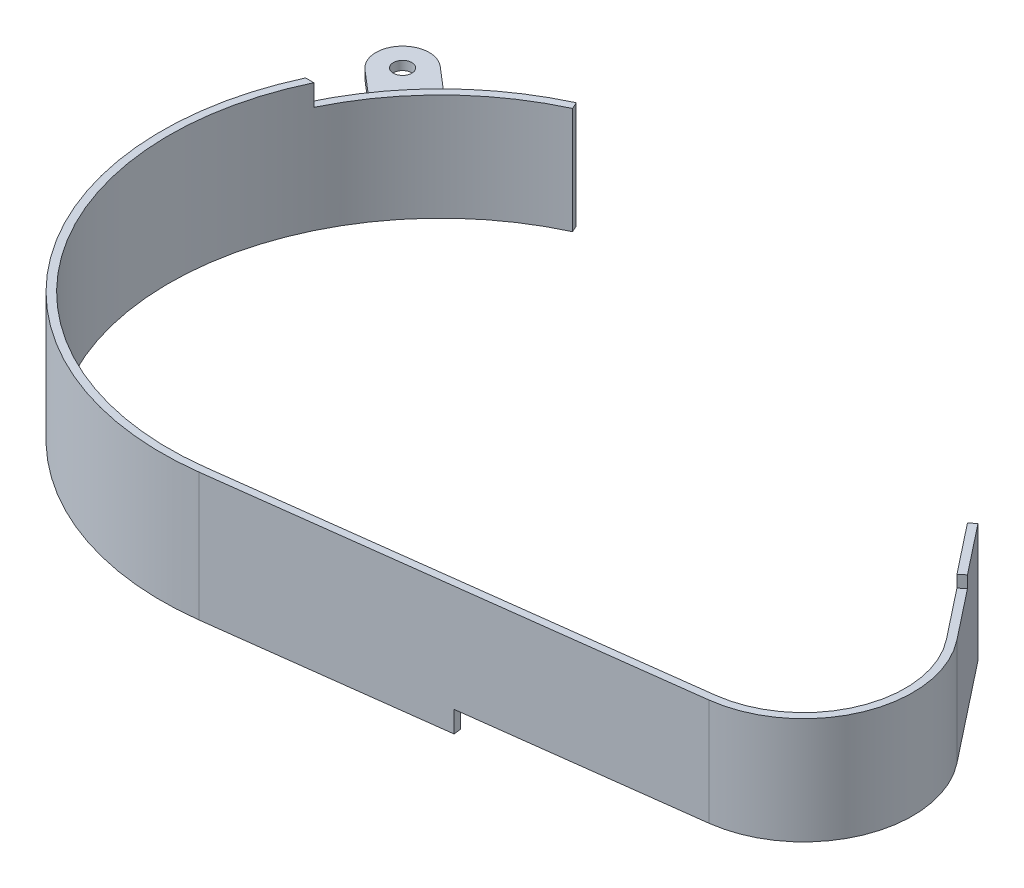
ISO-10303-21;
HEADER;
FILE_DESCRIPTION(('STEP AP214'),'2;1');
FILE_NAME('part.step','',(''),(''),'','','');
FILE_SCHEMA(('AUTOMOTIVE_DESIGN { 1 0 10303 214 1 1 1 1 }'));
ENDSEC;
DATA;
#1=APPLICATION_CONTEXT('core data for automotive mechanical design processes');
#2=APPLICATION_PROTOCOL_DEFINITION('international standard','automotive_design',2000,#1);
#3=PRODUCT_CONTEXT('',#1,'mechanical');
#4=PRODUCT('Part','Part','',(#3));
#5=PRODUCT_RELATED_PRODUCT_CATEGORY('part','',(#4));
#6=PRODUCT_DEFINITION_FORMATION('','',#4);
#7=PRODUCT_DEFINITION_CONTEXT('part definition',#1,'design');
#8=PRODUCT_DEFINITION('design','',#6,#7);
#9=PRODUCT_DEFINITION_SHAPE('','',#8);
#10=(LENGTH_UNIT() NAMED_UNIT(*) SI_UNIT(.MILLI.,.METRE.));
#11=(NAMED_UNIT(*) PLANE_ANGLE_UNIT() SI_UNIT($,.RADIAN.));
#12=(NAMED_UNIT(*) SI_UNIT($,.STERADIAN.) SOLID_ANGLE_UNIT());
#13=UNCERTAINTY_MEASURE_WITH_UNIT(LENGTH_MEASURE(1.E-05),#10,'distance_accuracy_value','');
#14=(GEOMETRIC_REPRESENTATION_CONTEXT(3) GLOBAL_UNCERTAINTY_ASSIGNED_CONTEXT((#13)) GLOBAL_UNIT_ASSIGNED_CONTEXT((#10,
#11,#12)) REPRESENTATION_CONTEXT('',''));
#15=CARTESIAN_POINT('',(0.,0.,0.));
#16=DIRECTION('',(0.,0.,1.));
#17=DIRECTION('',(1.,0.,0.));
#18=AXIS2_PLACEMENT_3D('',#15,#16,#17);
#19=CARTESIAN_POINT('',(-669.29,0.,84.2514773719377));
#20=DIRECTION('',(0.,-1.,0.));
#21=DIRECTION('',(0.,0.,-1.));
#22=AXIS2_PLACEMENT_3D('',#19,#20,#21);
#23=PLANE('',#22);
#24=DIRECTION('',(0.766194829754674,0.,-0.642608343283221));
#25=VECTOR('',#24,1.);
#26=CARTESIAN_POINT('',(-485.591791320348,0.,83.6321348892451));
#27=LINE('',#26,#25);
#28=CARTESIAN_POINT('',(-485.591791320348,0.,83.6321348892451));
#29=VERTEX_POINT('',#28);
#30=CARTESIAN_POINT('',(-483.547414247584,0.,81.9175138649877));
#31=VERTEX_POINT('',#30);
#32=EDGE_CURVE('E61',#29,#31,#27,.T.);
#33=ORIENTED_EDGE('',*,*,#32,.F.);
#34=DIRECTION('',(0.61913837589609,0.,0.785281905746435));
#35=VECTOR('',#34,1.);
#36=CARTESIAN_POINT('',(-471.62152618742,0.,101.351269826553));
#37=LINE('',#36,#35);
#38=CARTESIAN_POINT('',(-471.62152618742,0.,101.351269826552));
#39=VERTEX_POINT('',#38);
#40=EDGE_CURVE('E325',#29,#39,#37,.T.);
#41=ORIENTED_EDGE('',*,*,#40,.T.);
#42=CARTESIAN_POINT('',(-500.126000000001,0.,123.824999951937));
#43=DIRECTION('',(0.,-1.,0.));
#44=DIRECTION('',(0.,0.,1.));
#45=AXIS2_PLACEMENT_3D('',#42,#43,#44);
#46=CIRCLE('',#45,36.2983962880004);
#47=CARTESIAN_POINT('',(-495.540915966686,0.,159.832646049512));
#48=VERTEX_POINT('',#47);
#49=EDGE_CURVE('E327',#39,#48,#46,.T.);
#50=ORIENTED_EDGE('',*,*,#49,.T.);
#51=DIRECTION('',(-0.991989999003838,0.,0.126316435495806));
#52=VECTOR('',#51,1.);
#53=CARTESIAN_POINT('',(-657.047015902535,0.,180.398251423772));
#54=LINE('',#53,#52);
#55=CARTESIAN_POINT('',(-657.047015902535,0.,180.398251423772));
#56=VERTEX_POINT('',#55);
#57=EDGE_CURVE('E299',#48,#56,#54,.T.);
#58=ORIENTED_EDGE('',*,*,#57,.T.);
#59=CARTESIAN_POINT('',(-669.29,0.,84.2514773719377));
#60=DIRECTION('',(0.,-1.,0.));
#61=DIRECTION('',(0.,0.,-1.));
#62=AXIS2_PLACEMENT_3D('',#59,#60,#61);
#63=CIRCLE('',#62,96.9231284069251);
#64=CARTESIAN_POINT('',(-756.600744677042,0.,42.1690976373534));
#65=VERTEX_POINT('',#64);
#66=EDGE_CURVE('E294',#56,#65,#63,.T.);
#67=ORIENTED_EDGE('',*,*,#66,.T.);
#68=DIRECTION('',(1.,0.,0.));
#69=VECTOR('',#68,1.);
#70=CARTESIAN_POINT('',(-756.600744677042,0.,42.1690976373534));
#71=LINE('',#70,#69);
#72=CARTESIAN_POINT('',(-759.552212425699,0.,42.1690976373534));
#73=VERTEX_POINT('',#72);
#74=EDGE_CURVE('E272',#73,#65,#71,.T.);
#75=ORIENTED_EDGE('',*,*,#74,.F.);
#76=CARTESIAN_POINT('',(-669.29,0.,84.2514773719377));
#77=DIRECTION('',(0.,1.,0.));
#78=DIRECTION('',(0.,0.,-1.));
#79=AXIS2_PLACEMENT_3D('',#76,#77,#78);
#80=CIRCLE('',#79,99.590128406925);
#81=CARTESIAN_POINT('',(-656.710129969068,0.,183.043888751115));
#82=VERTEX_POINT('',#81);
#83=EDGE_CURVE('E315',#73,#82,#80,.T.);
#84=ORIENTED_EDGE('',*,*,#83,.T.);
#85=DIRECTION('',(0.991989999003838,0.,-0.126316435495805));
#86=VECTOR('',#85,1.);
#87=CARTESIAN_POINT('',(-656.710129969068,0.,183.043888751115));
#88=LINE('',#87,#86);
#89=CARTESIAN_POINT('',(-495.204030033218,0.,162.478283376855));
#90=VERTEX_POINT('',#89);
#91=EDGE_CURVE('E317',#82,#90,#88,.T.);
#92=ORIENTED_EDGE('',*,*,#91,.T.);
#93=CARTESIAN_POINT('',(-500.126,0.,123.824999951938));
#94=DIRECTION('',(0.,1.,0.));
#95=DIRECTION('',(0.,0.,-1.));
#96=AXIS2_PLACEMENT_3D('',#93,#94,#95);
#97=CIRCLE('',#96,38.9653962880001);
#98=CARTESIAN_POINT('',(-469.527179344794,0.,99.7000277780376));
#99=VERTEX_POINT('',#98);
#100=EDGE_CURVE('E320',#90,#99,#97,.T.);
#101=ORIENTED_EDGE('',*,*,#100,.T.);
#102=DIRECTION('',(-0.619138375896093,0.,-0.785281905746432));
#103=VECTOR('',#102,1.);
#104=CARTESIAN_POINT('',(-469.527179344794,0.,99.7000277780376));
#105=LINE('',#104,#103);
#106=EDGE_CURVE('E323',#99,#31,#105,.T.);
#107=ORIENTED_EDGE('',*,*,#106,.T.);
#108=EDGE_LOOP('',(#33,#41,#50,#58,#67,#75,#84,#92,#101,#107));
#109=FACE_BOUND('',#108,.T.);
#110=ADVANCED_FACE('F44',(#109),#23,.F.);
#111=CARTESIAN_POINT('',(-669.29,-38.1,84.2514773719377));
#112=DIRECTION('',(0.,1.,0.));
#113=DIRECTION('',(0.,0.,1.));
#114=AXIS2_PLACEMENT_3D('',#111,#112,#113);
#115=CYLINDRICAL_SURFACE('',#114,99.590128406925);
#116=DIRECTION('',(0.,1.,0.));
#117=VECTOR('',#116,1.);
#118=CARTESIAN_POINT('',(-759.552212425699,-7.62,42.1690976373533));
#119=LINE('',#118,#117);
#120=CARTESIAN_POINT('',(-759.552212425699,-7.62,42.1690976373533));
#121=VERTEX_POINT('',#120);
#122=EDGE_CURVE('E289',#121,#73,#119,.T.);
#123=ORIENTED_EDGE('',*,*,#122,.F.);
#124=CARTESIAN_POINT('',(-669.29,-7.62,84.2514773719377));
#125=DIRECTION('',(0.,1.,0.));
#126=DIRECTION('',(0.,0.,-1.));
#127=AXIS2_PLACEMENT_3D('',#124,#125,#126);
#128=CIRCLE('',#127,99.5901284069251);
#129=CARTESIAN_POINT('',(-711.2,-7.62,-6.0909023626467));
#130=VERTEX_POINT('',#129);
#131=EDGE_CURVE('E284',#130,#121,#128,.T.);
#132=ORIENTED_EDGE('',*,*,#131,.F.);
#133=DIRECTION('',(0.,1.,0.));
#134=VECTOR('',#133,1.);
#135=CARTESIAN_POINT('',(-711.2,-38.1,-6.0909023626466));
#136=LINE('',#135,#134);
#137=CARTESIAN_POINT('',(-711.2,-45.72,-6.0909023626466));
#138=VERTEX_POINT('',#137);
#139=EDGE_CURVE('E342',#138,#130,#136,.T.);
#140=ORIENTED_EDGE('',*,*,#139,.F.);
#141=CARTESIAN_POINT('',(-669.29,-45.72,84.2514773719377));
#142=DIRECTION('',(0.,-1.,0.));
#143=DIRECTION('',(0.,0.,-1.));
#144=AXIS2_PLACEMENT_3D('',#141,#142,#143);
#145=CIRCLE('',#144,99.590128406925);
#146=CARTESIAN_POINT('',(-656.710129969068,-45.72,183.043888751115));
#147=VERTEX_POINT('',#146);
#148=EDGE_CURVE('E229',#147,#138,#145,.T.);
#149=ORIENTED_EDGE('',*,*,#148,.F.);
#150=DIRECTION('',(0.,1.,0.));
#151=VECTOR('',#150,1.);
#152=CARTESIAN_POINT('',(-656.710129969068,-38.1,183.043888751115));
#153=LINE('',#152,#151);
#154=EDGE_CURVE('E340',#147,#82,#153,.T.);
#155=ORIENTED_EDGE('',*,*,#154,.T.);
#156=ORIENTED_EDGE('',*,*,#83,.F.);
#157=EDGE_LOOP('',(#123,#132,#140,#149,#155,#156));
#158=FACE_BOUND('',#157,.T.);
#159=DIRECTION('',(0.,1.,0.));
#160=VECTOR('',#159,1.);
#161=CARTESIAN_POINT('',(-751.193944792643,-15.10675668,27.5951670127952));
#162=LINE('',#161,#160);
#163=CARTESIAN_POINT('',(-751.193944792643,-15.10675668,27.5951670127951));
#164=VERTEX_POINT('',#163);
#165=CARTESIAN_POINT('',(-751.193944792643,-11.93175668,27.5951670127951));
#166=VERTEX_POINT('',#165);
#167=EDGE_CURVE('E257',#164,#166,#162,.T.);
#168=ORIENTED_EDGE('',*,*,#167,.F.);
#169=CARTESIAN_POINT('',(-669.29,-15.10675668,84.2514773719377));
#170=DIRECTION('',(0.,1.,0.));
#171=DIRECTION('',(0.,0.,1.));
#172=AXIS2_PLACEMENT_3D('',#169,#170,#171);
#173=CIRCLE('',#172,99.590128406925);
#174=CARTESIAN_POINT('',(-738.912633033104,-15.10675668,13.0413471540705));
#175=VERTEX_POINT('',#174);
#176=EDGE_CURVE('E246',#164,#175,#173,.F.);
#177=ORIENTED_EDGE('',*,*,#176,.T.);
#178=DIRECTION('',(0.,1.,0.));
#179=VECTOR('',#178,1.);
#180=CARTESIAN_POINT('',(-738.912633033104,-15.10675668,13.0413471540706));
#181=LINE('',#180,#179);
#182=CARTESIAN_POINT('',(-738.912633033104,-11.93175668,13.0413471540706));
#183=VERTEX_POINT('',#182);
#184=EDGE_CURVE('E276',#175,#183,#181,.T.);
#185=ORIENTED_EDGE('',*,*,#184,.T.);
#186=CARTESIAN_POINT('',(-669.29,-11.93175668,84.2514773719377));
#187=DIRECTION('',(0.,1.,0.));
#188=DIRECTION('',(0.,0.,1.));
#189=AXIS2_PLACEMENT_3D('',#186,#187,#188);
#190=CIRCLE('',#189,99.590128406925);
#191=EDGE_CURVE('E260',#166,#183,#190,.F.);
#192=ORIENTED_EDGE('',*,*,#191,.F.);
#193=EDGE_LOOP('',(#168,#177,#185,#192));
#194=FACE_BOUND('',#193,.T.);
#195=ADVANCED_FACE('F358',(#158,#194),#115,.T.);
#196=CARTESIAN_POINT('',(-710.077660147768,-38.1,-3.6715548770441));
#197=DIRECTION('',(0.907141914361682,0.,-0.420824841481849));
#198=DIRECTION('',(-0.420824841481849,0.,-0.907141914361682));
#199=AXIS2_PLACEMENT_3D('',#196,#197,#198);
#200=PLANE('',#199);
#201=ORIENTED_EDGE('',*,*,#139,.T.);
#202=DIRECTION('',(-0.420824841481849,0.,-0.907141914361682));
#203=VECTOR('',#202,1.);
#204=CARTESIAN_POINT('',(-710.077660147768,-7.62,-3.6715548770441));
#205=LINE('',#204,#203);
#206=CARTESIAN_POINT('',(-710.077660147768,-7.62,-3.6715548770441));
#207=VERTEX_POINT('',#206);
#208=EDGE_CURVE('E282',#207,#130,#205,.T.);
#209=ORIENTED_EDGE('',*,*,#208,.F.);
#210=DIRECTION('',(0.,1.,0.));
#211=VECTOR('',#210,1.);
#212=CARTESIAN_POINT('',(-710.077660147768,-38.1,-3.6715548770441));
#213=LINE('',#212,#211);
#214=CARTESIAN_POINT('',(-710.077660147768,-45.72,-3.6715548770441));
#215=VERTEX_POINT('',#214);
#216=EDGE_CURVE('E48',#215,#207,#213,.T.);
#217=ORIENTED_EDGE('',*,*,#216,.F.);
#218=DIRECTION('',(0.420824841481863,0.,0.907141914361675));
#219=VECTOR('',#218,1.);
#220=CARTESIAN_POINT('',(-710.077660147768,-45.72,-3.6715548770441));
#221=LINE('',#220,#219);
#222=EDGE_CURVE('E232',#138,#215,#221,.T.);
#223=ORIENTED_EDGE('',*,*,#222,.F.);
#224=EDGE_LOOP('',(#201,#209,#217,#223));
#225=FACE_BOUND('',#224,.T.);
#226=ADVANCED_FACE('F351',(#225),#200,.T.);
#227=CARTESIAN_POINT('',(-669.29,-38.1,84.2514773719377));
#228=DIRECTION('',(0.,1.,0.));
#229=DIRECTION('',(0.,0.,1.));
#230=AXIS2_PLACEMENT_3D('',#227,#228,#229);
#231=CYLINDRICAL_SURFACE('',#230,96.9231284069251);
#232=DIRECTION('',(0.,1.,0.));
#233=VECTOR('',#232,1.);
#234=CARTESIAN_POINT('',(-756.600744677042,-7.62,42.1690976373534));
#235=LINE('',#234,#233);
#236=CARTESIAN_POINT('',(-756.600744677042,-7.62,42.1690976373534));
#237=VERTEX_POINT('',#236);
#238=EDGE_CURVE('E291',#237,#65,#235,.T.);
#239=ORIENTED_EDGE('',*,*,#238,.T.);
#240=ORIENTED_EDGE('',*,*,#66,.F.);
#241=DIRECTION('',(0.,1.,0.));
#242=VECTOR('',#241,1.);
#243=CARTESIAN_POINT('',(-657.047015902535,-38.1,180.398251423772));
#244=LINE('',#243,#242);
#245=CARTESIAN_POINT('',(-657.047015902535,-45.72,180.398251423772));
#246=VERTEX_POINT('',#245);
#247=EDGE_CURVE('E12',#246,#56,#244,.T.);
#248=ORIENTED_EDGE('',*,*,#247,.F.);
#249=CARTESIAN_POINT('',(-669.29,-45.72,84.2514773719377));
#250=DIRECTION('',(0.,1.,0.));
#251=DIRECTION('',(0.,0.,-1.));
#252=AXIS2_PLACEMENT_3D('',#249,#250,#251);
#253=CIRCLE('',#252,96.9231284069251);
#254=EDGE_CURVE('E219',#215,#246,#253,.T.);
#255=ORIENTED_EDGE('',*,*,#254,.F.);
#256=ORIENTED_EDGE('',*,*,#216,.T.);
#257=CARTESIAN_POINT('',(-669.29,-7.62,84.2514773719377));
#258=DIRECTION('',(0.,-1.,0.));
#259=DIRECTION('',(0.,0.,1.));
#260=AXIS2_PLACEMENT_3D('',#257,#258,#259);
#261=CIRCLE('',#260,96.9231284069251);
#262=EDGE_CURVE('E280',#237,#207,#261,.T.);
#263=ORIENTED_EDGE('',*,*,#262,.F.);
#264=EDGE_LOOP('',(#239,#240,#248,#255,#256,#263));
#265=FACE_BOUND('',#264,.T.);
#266=ADVANCED_FACE('F46',(#265),#231,.F.);
#267=CARTESIAN_POINT('',(-657.047015902535,-38.1,180.398251423772));
#268=DIRECTION('',(-0.126316435495806,0.,-0.991989999003838));
#269=DIRECTION('',(-0.991989999003838,0.,0.126316435495806));
#270=AXIS2_PLACEMENT_3D('',#267,#268,#269);
#271=PLANE('',#270);
#272=ORIENTED_EDGE('',*,*,#57,.F.);
#273=DIRECTION('',(0.,1.,0.));
#274=VECTOR('',#273,1.);
#275=CARTESIAN_POINT('',(-495.540915966686,-38.1,159.832646049512));
#276=LINE('',#275,#274);
#277=CARTESIAN_POINT('',(-495.540915966686,-38.1,159.832646049512));
#278=VERTEX_POINT('',#277);
#279=EDGE_CURVE('E53',#278,#48,#276,.T.);
#280=ORIENTED_EDGE('',*,*,#279,.F.);
#281=DIRECTION('',(-0.991989999003838,0.,0.126316435495806));
#282=VECTOR('',#281,1.);
#283=CARTESIAN_POINT('',(-657.047015902535,-38.1,180.398251423772));
#284=LINE('',#283,#282);
#285=CARTESIAN_POINT('',(-576.29396593461,-38.1,170.115448736642));
#286=VERTEX_POINT('',#285);
#287=EDGE_CURVE('E311',#278,#286,#284,.T.);
#288=ORIENTED_EDGE('',*,*,#287,.T.);
#289=DIRECTION('',(0.,1.,0.));
#290=VECTOR('',#289,1.);
#291=CARTESIAN_POINT('',(-576.29396593461,-45.72,170.115448736642));
#292=LINE('',#291,#290);
#293=CARTESIAN_POINT('',(-576.29396593461,-45.72,170.115448736642));
#294=VERTEX_POINT('',#293);
#295=EDGE_CURVE('E239',#294,#286,#292,.T.);
#296=ORIENTED_EDGE('',*,*,#295,.F.);
#297=DIRECTION('',(0.991989999003838,0.,-0.126316435495806));
#298=VECTOR('',#297,1.);
#299=CARTESIAN_POINT('',(-657.047015902535,-45.72,180.398251423772));
#300=LINE('',#299,#298);
#301=EDGE_CURVE('E222',#246,#294,#300,.T.);
#302=ORIENTED_EDGE('',*,*,#301,.F.);
#303=ORIENTED_EDGE('',*,*,#247,.T.);
#304=EDGE_LOOP('',(#272,#280,#288,#296,#302,#303));
#305=FACE_BOUND('',#304,.T.);
#306=ADVANCED_FACE('F373',(#305),#271,.T.);
#307=CARTESIAN_POINT('',(-500.126000000001,-38.1,123.824999951937));
#308=DIRECTION('',(0.,1.,0.));
#309=DIRECTION('',(0.,0.,1.));
#310=AXIS2_PLACEMENT_3D('',#307,#308,#309);
#311=CYLINDRICAL_SURFACE('',#310,36.2983962880004);
#312=ORIENTED_EDGE('',*,*,#49,.F.);
#313=DIRECTION('',(0.,1.,0.));
#314=VECTOR('',#313,1.);
#315=CARTESIAN_POINT('',(-471.62152618742,-38.1,101.351269826552));
#316=LINE('',#315,#314);
#317=CARTESIAN_POINT('',(-471.62152618742,-38.1,101.351269826552));
#318=VERTEX_POINT('',#317);
#319=EDGE_CURVE('E333',#318,#39,#316,.T.);
#320=ORIENTED_EDGE('',*,*,#319,.F.);
#321=CARTESIAN_POINT('',(-500.126000000001,-38.1,123.824999951937));
#322=DIRECTION('',(0.,-1.,0.));
#323=DIRECTION('',(0.,0.,1.));
#324=AXIS2_PLACEMENT_3D('',#321,#322,#323);
#325=CIRCLE('',#324,36.2983962880004);
#326=EDGE_CURVE('E308',#318,#278,#325,.T.);
#327=ORIENTED_EDGE('',*,*,#326,.T.);
#328=ORIENTED_EDGE('',*,*,#279,.T.);
#329=EDGE_LOOP('',(#312,#320,#327,#328));
#330=FACE_BOUND('',#329,.T.);
#331=ADVANCED_FACE('F395',(#330),#311,.F.);
#332=CARTESIAN_POINT('',(-471.62152618742,-38.1,101.351269826553));
#333=DIRECTION('',(-0.785281905746434,0.,0.61913837589609));
#334=DIRECTION('',(0.61913837589609,0.,0.785281905746435));
#335=AXIS2_PLACEMENT_3D('',#332,#333,#334);
#336=PLANE('',#335);
#337=ORIENTED_EDGE('',*,*,#40,.F.);
#338=DIRECTION('',(0.,-1.,0.));
#339=VECTOR('',#338,1.);
#340=CARTESIAN_POINT('',(-485.591791320348,4.26074332,83.6321348892451));
#341=LINE('',#340,#339);
#342=CARTESIAN_POINT('',(-485.591791320348,4.26074332,83.6321348892451));
#343=VERTEX_POINT('',#342);
#344=EDGE_CURVE('E216',#343,#29,#341,.T.);
#345=ORIENTED_EDGE('',*,*,#344,.F.);
#346=DIRECTION('',(0.619138375896092,0.,0.785281905746433));
#347=VECTOR('',#346,1.);
#348=CARTESIAN_POINT('',(-499.562056453275,4.26074332,65.9129999519377));
#349=LINE('',#348,#347);
#350=CARTESIAN_POINT('',(-499.562056453275,4.26074332,65.9129999519377));
#351=VERTEX_POINT('',#350);
#352=EDGE_CURVE('E203',#351,#343,#349,.T.);
#353=ORIENTED_EDGE('',*,*,#352,.F.);
#354=DIRECTION('',(0.,1.,0.));
#355=VECTOR('',#354,1.);
#356=CARTESIAN_POINT('',(-499.562056453275,-38.1,65.9129999519377));
#357=LINE('',#356,#355);
#358=CARTESIAN_POINT('',(-499.562056453275,-38.1,65.9129999519377));
#359=VERTEX_POINT('',#358);
#360=EDGE_CURVE('E195',#359,#351,#357,.T.);
#361=ORIENTED_EDGE('',*,*,#360,.F.);
#362=DIRECTION('',(0.61913837589609,0.,0.785281905746435));
#363=VECTOR('',#362,1.);
#364=CARTESIAN_POINT('',(-471.62152618742,-38.1,101.351269826553));
#365=LINE('',#364,#363);
#366=EDGE_CURVE('E305',#359,#318,#365,.T.);
#367=ORIENTED_EDGE('',*,*,#366,.T.);
#368=ORIENTED_EDGE('',*,*,#319,.T.);
#369=EDGE_LOOP('',(#337,#345,#353,#361,#367,#368));
#370=FACE_BOUND('',#369,.T.);
#371=ADVANCED_FACE('F391',(#370),#336,.T.);
#372=CARTESIAN_POINT('',(-499.562056453275,-38.1,65.9129999519377));
#373=DIRECTION('',(-0.665448965296002,0.,-0.74644334988429));
#374=DIRECTION('',(-0.74644334988429,0.,0.665448965296002));
#375=AXIS2_PLACEMENT_3D('',#372,#373,#374);
#376=PLANE('',#375);
#377=ORIENTED_EDGE('',*,*,#360,.T.);
#378=DIRECTION('',(-0.74644334988429,0.,0.665448965296002));
#379=VECTOR('',#378,1.);
#380=CARTESIAN_POINT('',(-497.567649150374,4.26074332,64.1349999519377));
#381=LINE('',#380,#379);
#382=CARTESIAN_POINT('',(-497.567649150374,4.26074332,64.1349999519377));
#383=VERTEX_POINT('',#382);
#384=EDGE_CURVE('E199',#383,#351,#381,.T.);
#385=ORIENTED_EDGE('',*,*,#384,.F.);
#386=DIRECTION('',(0.,1.,0.));
#387=VECTOR('',#386,1.);
#388=CARTESIAN_POINT('',(-497.567649150374,-38.1,64.1349999519377));
#389=LINE('',#388,#387);
#390=CARTESIAN_POINT('',(-497.567649150374,-38.1,64.1349999519377));
#391=VERTEX_POINT('',#390);
#392=EDGE_CURVE('E183',#391,#383,#389,.T.);
#393=ORIENTED_EDGE('',*,*,#392,.F.);
#394=DIRECTION('',(-0.74644334988429,0.,0.665448965296002));
#395=VECTOR('',#394,1.);
#396=CARTESIAN_POINT('',(-499.562056453275,-38.1,65.9129999519377));
#397=LINE('',#396,#395);
#398=EDGE_CURVE('E303',#391,#359,#397,.T.);
#399=ORIENTED_EDGE('',*,*,#398,.T.);
#400=EDGE_LOOP('',(#377,#385,#393,#399));
#401=FACE_BOUND('',#400,.T.);
#402=ADVANCED_FACE('F200',(#401),#376,.T.);
#403=CARTESIAN_POINT('',(-469.527179344794,-38.1,99.7000277780376));
#404=DIRECTION('',(0.785281905746432,0.,-0.619138375896092));
#405=DIRECTION('',(-0.619138375896093,0.,-0.785281905746433));
#406=AXIS2_PLACEMENT_3D('',#403,#404,#405);
#407=PLANE('',#406);
#408=ORIENTED_EDGE('',*,*,#106,.F.);
#409=DIRECTION('',(0.,1.,0.));
#410=VECTOR('',#409,1.);
#411=CARTESIAN_POINT('',(-469.527179344794,-38.1,99.7000277780376));
#412=LINE('',#411,#410);
#413=CARTESIAN_POINT('',(-469.527179344794,-38.1,99.7000277780376));
#414=VERTEX_POINT('',#413);
#415=EDGE_CURVE('E196',#414,#99,#412,.T.);
#416=ORIENTED_EDGE('',*,*,#415,.F.);
#417=DIRECTION('',(-0.619138375896093,0.,-0.785281905746432));
#418=VECTOR('',#417,1.);
#419=CARTESIAN_POINT('',(-469.527179344794,-38.1,99.7000277780376));
#420=LINE('',#419,#418);
#421=EDGE_CURVE('E191',#414,#391,#420,.T.);
#422=ORIENTED_EDGE('',*,*,#421,.T.);
#423=ORIENTED_EDGE('',*,*,#392,.T.);
#424=DIRECTION('',(-0.619138375896093,0.,-0.785281905746432));
#425=VECTOR('',#424,1.);
#426=CARTESIAN_POINT('',(-483.547414247584,4.26074332,81.9175138649877));
#427=LINE('',#426,#425);
#428=CARTESIAN_POINT('',(-483.547414247584,4.26074332,81.9175138649877));
#429=VERTEX_POINT('',#428);
#430=EDGE_CURVE('E189',#429,#383,#427,.T.);
#431=ORIENTED_EDGE('',*,*,#430,.F.);
#432=DIRECTION('',(0.,-1.,0.));
#433=VECTOR('',#432,1.);
#434=CARTESIAN_POINT('',(-483.547414247584,4.26074332,81.9175138649877));
#435=LINE('',#434,#433);
#436=EDGE_CURVE('E213',#429,#31,#435,.T.);
#437=ORIENTED_EDGE('',*,*,#436,.T.);
#438=EDGE_LOOP('',(#408,#416,#422,#423,#431,#437));
#439=FACE_BOUND('',#438,.T.);
#440=ADVANCED_FACE('F186',(#439),#407,.T.);
#441=CARTESIAN_POINT('',(-500.126,-38.1,123.824999951938));
#442=DIRECTION('',(0.,1.,0.));
#443=DIRECTION('',(0.,0.,1.));
#444=AXIS2_PLACEMENT_3D('',#441,#442,#443);
#445=CYLINDRICAL_SURFACE('',#444,38.9653962880001);
#446=ORIENTED_EDGE('',*,*,#100,.F.);
#447=DIRECTION('',(0.,1.,0.));
#448=VECTOR('',#447,1.);
#449=CARTESIAN_POINT('',(-495.204030033218,-38.1,162.478283376855));
#450=LINE('',#449,#448);
#451=CARTESIAN_POINT('',(-495.204030033218,-38.1,162.478283376855));
#452=VERTEX_POINT('',#451);
#453=EDGE_CURVE('E338',#452,#90,#450,.T.);
#454=ORIENTED_EDGE('',*,*,#453,.F.);
#455=CARTESIAN_POINT('',(-500.126,-38.1,123.824999951938));
#456=DIRECTION('',(0.,1.,0.));
#457=DIRECTION('',(0.,0.,-1.));
#458=AXIS2_PLACEMENT_3D('',#455,#456,#457);
#459=CIRCLE('',#458,38.9653962880001);
#460=EDGE_CURVE('E298',#452,#414,#459,.T.);
#461=ORIENTED_EDGE('',*,*,#460,.T.);
#462=ORIENTED_EDGE('',*,*,#415,.T.);
#463=EDGE_LOOP('',(#446,#454,#461,#462));
#464=FACE_BOUND('',#463,.T.);
#465=ADVANCED_FACE('F385',(#464),#445,.T.);
#466=CARTESIAN_POINT('',(-656.710129969068,-38.1,183.043888751115));
#467=DIRECTION('',(0.126316435495805,0.,0.991989999003838));
#468=DIRECTION('',(0.991989999003838,0.,-0.126316435495805));
#469=AXIS2_PLACEMENT_3D('',#466,#467,#468);
#470=PLANE('',#469);
#471=ORIENTED_EDGE('',*,*,#91,.F.);
#472=ORIENTED_EDGE('',*,*,#154,.F.);
#473=DIRECTION('',(-0.991989999003838,0.,0.126316435495805));
#474=VECTOR('',#473,1.);
#475=CARTESIAN_POINT('',(-656.710129969068,-45.72,183.043888751115));
#476=LINE('',#475,#474);
#477=CARTESIAN_POINT('',(-575.957080001143,-45.72,172.761086063985));
#478=VERTEX_POINT('',#477);
#479=EDGE_CURVE('E226',#478,#147,#476,.T.);
#480=ORIENTED_EDGE('',*,*,#479,.F.);
#481=DIRECTION('',(0.,1.,0.));
#482=VECTOR('',#481,1.);
#483=CARTESIAN_POINT('',(-575.957080001143,-45.72,172.761086063985));
#484=LINE('',#483,#482);
#485=CARTESIAN_POINT('',(-575.957080001143,-38.1,172.761086063985));
#486=VERTEX_POINT('',#485);
#487=EDGE_CURVE('E235',#478,#486,#484,.T.);
#488=ORIENTED_EDGE('',*,*,#487,.T.);
#489=DIRECTION('',(0.991989999003838,0.,-0.126316435495805));
#490=VECTOR('',#489,1.);
#491=CARTESIAN_POINT('',(-656.710129969068,-38.1,183.043888751115));
#492=LINE('',#491,#490);
#493=EDGE_CURVE('E296',#486,#452,#492,.T.);
#494=ORIENTED_EDGE('',*,*,#493,.T.);
#495=ORIENTED_EDGE('',*,*,#453,.T.);
#496=EDGE_LOOP('',(#471,#472,#480,#488,#494,#495));
#497=FACE_BOUND('',#496,.T.);
#498=ADVANCED_FACE('F381',(#497),#470,.T.);
#499=CARTESIAN_POINT('',(-669.29,-38.1,84.2514773719377));
#500=DIRECTION('',(0.,-1.,0.));
#501=DIRECTION('',(0.,0.,-1.));
#502=AXIS2_PLACEMENT_3D('',#499,#500,#501);
#503=PLANE('',#502);
#504=DIRECTION('',(0.126316435495788,0.,0.99198999900384));
#505=VECTOR('',#504,1.);
#506=CARTESIAN_POINT('',(-575.957080001143,-38.1,172.761086063985));
#507=LINE('',#506,#505);
#508=EDGE_CURVE('E69',#286,#486,#507,.T.);
#509=ORIENTED_EDGE('',*,*,#508,.F.);
#510=ORIENTED_EDGE('',*,*,#287,.F.);
#511=ORIENTED_EDGE('',*,*,#326,.F.);
#512=ORIENTED_EDGE('',*,*,#366,.F.);
#513=ORIENTED_EDGE('',*,*,#398,.F.);
#514=ORIENTED_EDGE('',*,*,#421,.F.);
#515=ORIENTED_EDGE('',*,*,#460,.F.);
#516=ORIENTED_EDGE('',*,*,#493,.F.);
#517=EDGE_LOOP('',(#509,#510,#511,#512,#513,#514,#515,#516));
#518=FACE_BOUND('',#517,.T.);
#519=ADVANCED_FACE('F396',(#518),#503,.T.);
#520=CARTESIAN_POINT('',(-756.600744677042,-7.62,42.1690976373534));
#521=DIRECTION('',(0.,0.,1.));
#522=DIRECTION('',(1.,0.,0.));
#523=AXIS2_PLACEMENT_3D('',#520,#521,#522);
#524=PLANE('',#523);
#525=ORIENTED_EDGE('',*,*,#74,.T.);
#526=ORIENTED_EDGE('',*,*,#238,.F.);
#527=DIRECTION('',(1.,0.,0.));
#528=VECTOR('',#527,1.);
#529=CARTESIAN_POINT('',(-756.600744677042,-7.62,42.1690976373534));
#530=LINE('',#529,#528);
#531=EDGE_CURVE('E286',#121,#237,#530,.T.);
#532=ORIENTED_EDGE('',*,*,#531,.F.);
#533=ORIENTED_EDGE('',*,*,#122,.T.);
#534=EDGE_LOOP('',(#525,#526,#532,#533));
#535=FACE_BOUND('',#534,.T.);
#536=ADVANCED_FACE('F367',(#535),#524,.F.);
#537=CARTESIAN_POINT('',(-669.29,-7.62,84.2514773719377));
#538=DIRECTION('',(0.,1.,0.));
#539=DIRECTION('',(0.,0.,1.));
#540=AXIS2_PLACEMENT_3D('',#537,#538,#539);
#541=PLANE('',#540);
#542=ORIENTED_EDGE('',*,*,#262,.T.);
#543=ORIENTED_EDGE('',*,*,#208,.T.);
#544=ORIENTED_EDGE('',*,*,#131,.T.);
#545=ORIENTED_EDGE('',*,*,#531,.T.);
#546=EDGE_LOOP('',(#542,#543,#544,#545));
#547=FACE_BOUND('',#546,.T.);
#548=ADVANCED_FACE('F365',(#547),#541,.T.);
#549=CARTESIAN_POINT('',(-332.282068789321,-15.10675668,387.143640281363));
#550=DIRECTION('',(-0.651293663705703,0.,0.758825779488811));
#551=DIRECTION('',(0.758825779488811,0.,0.651293663705703));
#552=AXIS2_PLACEMENT_3D('',#549,#550,#551);
#553=PLANE('',#552);
#554=DIRECTION('',(0.758825779488812,0.,0.651293663705703));
#555=VECTOR('',#554,1.);
#556=CARTESIAN_POINT('',(-332.282068789321,-11.93175668,387.143640281363));
#557=LINE('',#556,#555);
#558=CARTESIAN_POINT('',(-763.481160966797,-11.93175668,17.0491546669843));
#559=VERTEX_POINT('',#558);
#560=EDGE_CURVE('E242',#559,#166,#557,.T.);
#561=ORIENTED_EDGE('',*,*,#560,.F.);
#562=DIRECTION('',(0.,1.,0.));
#563=VECTOR('',#562,1.);
#564=CARTESIAN_POINT('',(-763.481160966797,-15.10675668,17.0491546669843));
#565=LINE('',#564,#563);
#566=CARTESIAN_POINT('',(-763.481160966797,-15.10675668,17.0491546669843));
#567=VERTEX_POINT('',#566);
#568=EDGE_CURVE('E270',#567,#559,#565,.T.);
#569=ORIENTED_EDGE('',*,*,#568,.F.);
#570=DIRECTION('',(0.758825779488812,0.,0.651293663705703));
#571=VECTOR('',#570,1.);
#572=CARTESIAN_POINT('',(-332.282068789321,-15.10675668,387.143640281363));
#573=LINE('',#572,#571);
#574=EDGE_CURVE('E243',#567,#164,#573,.T.);
#575=ORIENTED_EDGE('',*,*,#574,.T.);
#576=ORIENTED_EDGE('',*,*,#167,.T.);
#577=EDGE_LOOP('',(#561,#569,#575,#576));
#578=FACE_BOUND('',#577,.T.);
#579=ADVANCED_FACE('F517',(#578),#553,.T.);
#580=CARTESIAN_POINT('',(-757.27758882,-15.10675668,9.82133911735338));
#581=DIRECTION('',(0.,1.,0.));
#582=DIRECTION('',(0.,0.,1.));
#583=AXIS2_PLACEMENT_3D('',#580,#581,#582);
#584=CYLINDRICAL_SURFACE('',#583,9.52500000000003);
#585=CARTESIAN_POINT('',(-757.27758882,-11.93175668,9.82133911735338));
#586=DIRECTION('',(0.,1.,0.));
#587=DIRECTION('',(0.,0.,1.));
#588=AXIS2_PLACEMENT_3D('',#585,#586,#587);
#589=CIRCLE('',#588,9.52500000000003);
#590=CARTESIAN_POINT('',(-751.074016673201,-11.93175668,2.59352356772408));
#591=VERTEX_POINT('',#590);
#592=EDGE_CURVE('E266',#559,#591,#589,.F.);
#593=ORIENTED_EDGE('',*,*,#592,.T.);
#594=DIRECTION('',(0.,1.,0.));
#595=VECTOR('',#594,1.);
#596=CARTESIAN_POINT('',(-751.074016673201,-15.10675668,2.59352356772408));
#597=LINE('',#596,#595);
#598=CARTESIAN_POINT('',(-751.074016673201,-15.10675668,2.59352356772408));
#599=VERTEX_POINT('',#598);
#600=EDGE_CURVE('E273',#599,#591,#597,.T.);
#601=ORIENTED_EDGE('',*,*,#600,.F.);
#602=CARTESIAN_POINT('',(-757.27758882,-15.10675668,9.82133911735338));
#603=DIRECTION('',(0.,1.,0.));
#604=DIRECTION('',(0.,0.,1.));
#605=AXIS2_PLACEMENT_3D('',#602,#603,#604);
#606=CIRCLE('',#605,9.52500000000003);
#607=EDGE_CURVE('E252',#567,#599,#606,.F.);
#608=ORIENTED_EDGE('',*,*,#607,.F.);
#609=ORIENTED_EDGE('',*,*,#568,.T.);
#610=EDGE_LOOP('',(#593,#601,#608,#609));
#611=FACE_BOUND('',#610,.T.);
#612=ADVANCED_FACE('F514',(#611),#584,.T.);
#613=CARTESIAN_POINT('',(-320.219899292076,-15.10675668,372.739548318322));
#614=DIRECTION('',(-0.65164599485572,0.,0.758523234573932));
#615=DIRECTION('',(0.758523234573932,0.,0.65164599485572));
#616=AXIS2_PLACEMENT_3D('',#613,#614,#615);
#617=PLANE('',#616);
#618=DIRECTION('',(0.758523234573932,0.,0.65164599485572));
#619=VECTOR('',#618,1.);
#620=CARTESIAN_POINT('',(-320.219899292076,-11.93175668,372.739548318322));
#621=LINE('',#620,#619);
#622=EDGE_CURVE('E263',#591,#183,#621,.T.);
#623=ORIENTED_EDGE('',*,*,#622,.T.);
#624=ORIENTED_EDGE('',*,*,#184,.F.);
#625=DIRECTION('',(0.758523234573932,0.,0.65164599485572));
#626=VECTOR('',#625,1.);
#627=CARTESIAN_POINT('',(-320.219899292076,-15.10675668,372.739548318322));
#628=LINE('',#627,#626);
#629=EDGE_CURVE('E249',#599,#175,#628,.T.);
#630=ORIENTED_EDGE('',*,*,#629,.F.);
#631=ORIENTED_EDGE('',*,*,#600,.T.);
#632=EDGE_LOOP('',(#623,#624,#630,#631));
#633=FACE_BOUND('',#632,.T.);
#634=ADVANCED_FACE('F512',(#633),#617,.F.);
#635=CARTESIAN_POINT('',(-757.27758882,-15.10675668,9.82133911735338));
#636=DIRECTION('',(0.,1.,0.));
#637=DIRECTION('',(0.,0.,1.));
#638=AXIS2_PLACEMENT_3D('',#635,#636,#637);
#639=CYLINDRICAL_SURFACE('',#638,3.29999999999998);
#640=CARTESIAN_POINT('',(-757.27758882,-15.10675668,9.82133911735338));
#641=DIRECTION('',(0.,1.,0.));
#642=DIRECTION('',(0.,0.,1.));
#643=AXIS2_PLACEMENT_3D('',#640,#641,#642);
#644=CIRCLE('',#643,3.29999999999998);
#645=CARTESIAN_POINT('',(-757.27758882,-15.10675668,13.1213391173534));
#646=VERTEX_POINT('',#645);
#647=EDGE_CURVE('E254',#646,#646,#644,.T.);
#648=ORIENTED_EDGE('',*,*,#647,.F.);
#649=EDGE_LOOP('',(#648));
#650=FACE_BOUND('',#649,.T.);
#651=CARTESIAN_POINT('',(-757.27758882,-11.93175668,9.82133911735338));
#652=DIRECTION('',(0.,1.,0.));
#653=DIRECTION('',(0.,0.,1.));
#654=AXIS2_PLACEMENT_3D('',#651,#652,#653);
#655=CIRCLE('',#654,3.29999999999998);
#656=CARTESIAN_POINT('',(-757.27758882,-11.93175668,13.1213391173534));
#657=VERTEX_POINT('',#656);
#658=EDGE_CURVE('E247',#657,#657,#655,.T.);
#659=ORIENTED_EDGE('',*,*,#658,.T.);
#660=EDGE_LOOP('',(#659));
#661=FACE_BOUND('',#660,.T.);
#662=ADVANCED_FACE('F505',(#650,#661),#639,.F.);
#663=CARTESIAN_POINT('',(0.,-15.10675668,0.));
#664=DIRECTION('',(0.,1.,0.));
#665=DIRECTION('',(0.,0.,1.));
#666=AXIS2_PLACEMENT_3D('',#663,#664,#665);
#667=PLANE('',#666);
#668=ORIENTED_EDGE('',*,*,#574,.F.);
#669=ORIENTED_EDGE('',*,*,#607,.T.);
#670=ORIENTED_EDGE('',*,*,#629,.T.);
#671=ORIENTED_EDGE('',*,*,#176,.F.);
#672=EDGE_LOOP('',(#668,#669,#670,#671));
#673=FACE_BOUND('',#672,.T.);
#674=ORIENTED_EDGE('',*,*,#647,.T.);
#675=EDGE_LOOP('',(#674));
#676=FACE_BOUND('',#675,.T.);
#677=ADVANCED_FACE('F502',(#673,#676),#667,.F.);
#678=CARTESIAN_POINT('',(0.,-11.93175668,0.));
#679=DIRECTION('',(0.,1.,0.));
#680=DIRECTION('',(0.,0.,1.));
#681=AXIS2_PLACEMENT_3D('',#678,#679,#680);
#682=PLANE('',#681);
#683=ORIENTED_EDGE('',*,*,#560,.T.);
#684=ORIENTED_EDGE('',*,*,#191,.T.);
#685=ORIENTED_EDGE('',*,*,#622,.F.);
#686=ORIENTED_EDGE('',*,*,#592,.F.);
#687=EDGE_LOOP('',(#683,#684,#685,#686));
#688=FACE_BOUND('',#687,.T.);
#689=ORIENTED_EDGE('',*,*,#658,.F.);
#690=EDGE_LOOP('',(#689));
#691=FACE_BOUND('',#690,.T.);
#692=ADVANCED_FACE('F452',(#688,#691),#682,.T.);
#693=CARTESIAN_POINT('',(-575.957080001143,-45.72,172.761086063985));
#694=DIRECTION('',(-0.99198999900384,0.,0.126316435495788));
#695=DIRECTION('',(0.126316435495788,0.,0.99198999900384));
#696=AXIS2_PLACEMENT_3D('',#693,#694,#695);
#697=PLANE('',#696);
#698=ORIENTED_EDGE('',*,*,#508,.T.);
#699=ORIENTED_EDGE('',*,*,#487,.F.);
#700=DIRECTION('',(0.126316435495788,0.,0.99198999900384));
#701=VECTOR('',#700,1.);
#702=CARTESIAN_POINT('',(-575.957080001143,-45.72,172.761086063985));
#703=LINE('',#702,#701);
#704=EDGE_CURVE('E224',#294,#478,#703,.T.);
#705=ORIENTED_EDGE('',*,*,#704,.F.);
#706=ORIENTED_EDGE('',*,*,#295,.T.);
#707=EDGE_LOOP('',(#698,#699,#705,#706));
#708=FACE_BOUND('',#707,.T.);
#709=ADVANCED_FACE('F379',(#708),#697,.F.);
#710=CARTESIAN_POINT('',(-669.29,-45.72,84.2514773719377));
#711=DIRECTION('',(0.,-1.,0.));
#712=DIRECTION('',(0.,0.,-1.));
#713=AXIS2_PLACEMENT_3D('',#710,#711,#712);
#714=PLANE('',#713);
#715=ORIENTED_EDGE('',*,*,#254,.T.);
#716=ORIENTED_EDGE('',*,*,#301,.T.);
#717=ORIENTED_EDGE('',*,*,#704,.T.);
#718=ORIENTED_EDGE('',*,*,#479,.T.);
#719=ORIENTED_EDGE('',*,*,#148,.T.);
#720=ORIENTED_EDGE('',*,*,#222,.T.);
#721=EDGE_LOOP('',(#715,#716,#717,#718,#719,#720));
#722=FACE_BOUND('',#721,.T.);
#723=ADVANCED_FACE('F353',(#722),#714,.T.);
#724=CARTESIAN_POINT('',(-485.591791320348,4.26074332,83.6321348892451));
#725=DIRECTION('',(-0.642608343283221,0.,-0.766194829754674));
#726=DIRECTION('',(-0.766194829754674,0.,0.642608343283221));
#727=AXIS2_PLACEMENT_3D('',#724,#725,#726);
#728=PLANE('',#727);
#729=ORIENTED_EDGE('',*,*,#32,.T.);
#730=ORIENTED_EDGE('',*,*,#436,.F.);
#731=DIRECTION('',(0.766194829754674,0.,-0.642608343283221));
#732=VECTOR('',#731,1.);
#733=CARTESIAN_POINT('',(-485.591791320348,4.26074332,83.6321348892451));
#734=LINE('',#733,#732);
#735=EDGE_CURVE('E207',#343,#429,#734,.T.);
#736=ORIENTED_EDGE('',*,*,#735,.F.);
#737=ORIENTED_EDGE('',*,*,#344,.T.);
#738=EDGE_LOOP('',(#729,#730,#736,#737));
#739=FACE_BOUND('',#738,.T.);
#740=ADVANCED_FACE('F388',(#739),#728,.F.);
#741=CARTESIAN_POINT('',(0.,4.26074332,0.));
#742=DIRECTION('',(0.,-1.,0.));
#743=DIRECTION('',(0.,0.,-1.));
#744=AXIS2_PLACEMENT_3D('',#741,#742,#743);
#745=PLANE('',#744);
#746=ORIENTED_EDGE('',*,*,#430,.T.);
#747=ORIENTED_EDGE('',*,*,#384,.T.);
#748=ORIENTED_EDGE('',*,*,#352,.T.);
#749=ORIENTED_EDGE('',*,*,#735,.T.);
#750=EDGE_LOOP('',(#746,#747,#748,#749));
#751=FACE_BOUND('',#750,.T.);
#752=ADVANCED_FACE('F205',(#751),#745,.F.);
#753=CLOSED_SHELL('',(#110,#195,#226,#266,#306,#331,#371,#402,#440,#465,#498,#519,#536,#548,
#579,#612,#634,#662,#677,#692,#709,#723,#740,#752));
#754=MANIFOLD_SOLID_BREP('B2',#753);
#755=ADVANCED_BREP_SHAPE_REPRESENTATION('',(#18,#754),#14);
#756=SHAPE_DEFINITION_REPRESENTATION(#9,#755);
ENDSEC;
END-ISO-10303-21;
